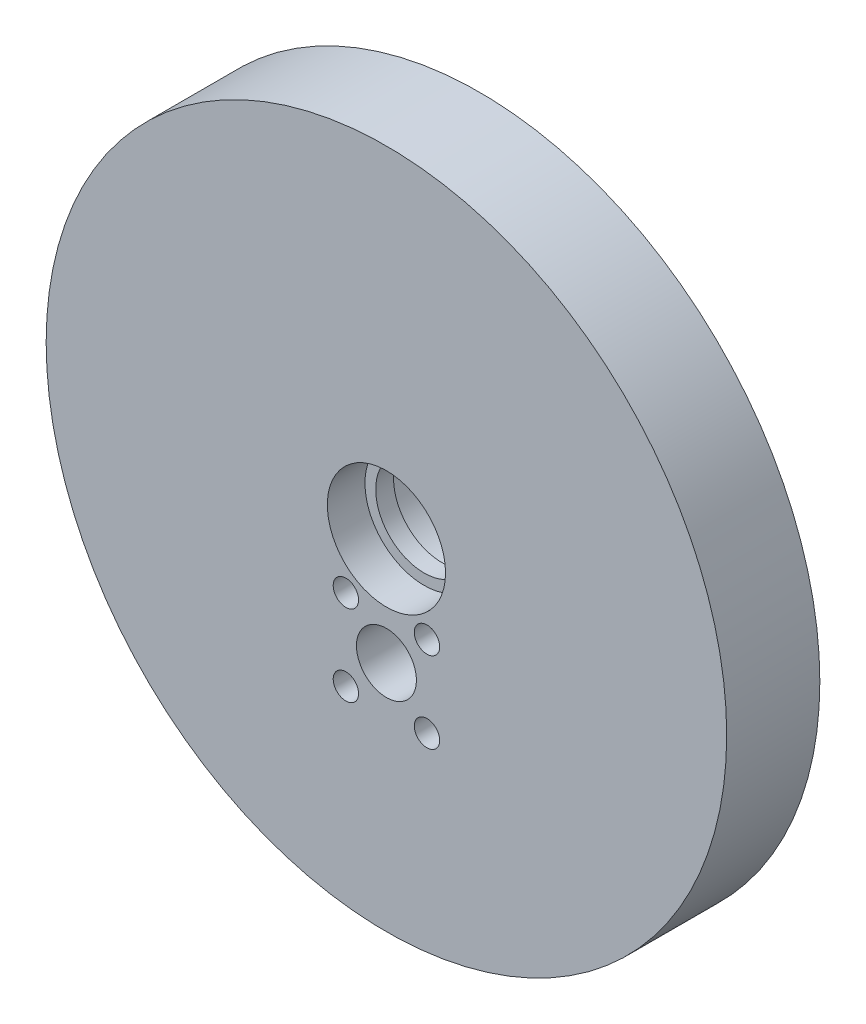
ISO-10303-21;
HEADER;
FILE_DESCRIPTION(('STEP AP214'),'2;1');
FILE_NAME('part.step','',(''),(''),'','','');
FILE_SCHEMA(('AUTOMOTIVE_DESIGN { 1 0 10303 214 1 1 1 1 }'));
ENDSEC;
DATA;
#1=APPLICATION_CONTEXT('core data for automotive mechanical design processes');
#2=APPLICATION_PROTOCOL_DEFINITION('international standard','automotive_design',2000,#1);
#3=PRODUCT_CONTEXT('',#1,'mechanical');
#4=PRODUCT('Part','Part','',(#3));
#5=PRODUCT_RELATED_PRODUCT_CATEGORY('part','',(#4));
#6=PRODUCT_DEFINITION_FORMATION('','',#4);
#7=PRODUCT_DEFINITION_CONTEXT('part definition',#1,'design');
#8=PRODUCT_DEFINITION('design','',#6,#7);
#9=PRODUCT_DEFINITION_SHAPE('','',#8);
#10=(LENGTH_UNIT() NAMED_UNIT(*) SI_UNIT(.MILLI.,.METRE.));
#11=(NAMED_UNIT(*) PLANE_ANGLE_UNIT() SI_UNIT($,.RADIAN.));
#12=(NAMED_UNIT(*) SI_UNIT($,.STERADIAN.) SOLID_ANGLE_UNIT());
#13=UNCERTAINTY_MEASURE_WITH_UNIT(LENGTH_MEASURE(1.E-05),#10,'distance_accuracy_value','');
#14=(GEOMETRIC_REPRESENTATION_CONTEXT(3) GLOBAL_UNCERTAINTY_ASSIGNED_CONTEXT((#13)) GLOBAL_UNIT_ASSIGNED_CONTEXT((#10,
#11,#12)) REPRESENTATION_CONTEXT('',''));
#15=CARTESIAN_POINT('',(0.,0.,0.));
#16=DIRECTION('',(0.,0.,1.));
#17=DIRECTION('',(1.,0.,0.));
#18=AXIS2_PLACEMENT_3D('',#15,#16,#17);
#19=CARTESIAN_POINT('',(0.,0.,13.208));
#20=DIRECTION('',(0.,0.,-1.));
#21=DIRECTION('',(-1.,0.,0.));
#22=AXIS2_PLACEMENT_3D('',#19,#20,#21);
#23=CYLINDRICAL_SURFACE('',#22,48.26);
#24=CARTESIAN_POINT('',(0.,0.,13.208));
#25=DIRECTION('',(0.,0.,1.));
#26=DIRECTION('',(1.,0.,0.));
#27=AXIS2_PLACEMENT_3D('',#24,#25,#26);
#28=CIRCLE('',#27,48.26);
#29=CARTESIAN_POINT('',(-48.26,0.,13.208));
#30=VERTEX_POINT('',#29);
#31=EDGE_CURVE('E10',#30,#30,#28,.T.);
#32=CARTESIAN_POINT('',(0.,0.,0.));
#33=DIRECTION('',(0.,0.,1.));
#34=DIRECTION('',(1.,0.,0.));
#35=AXIS2_PLACEMENT_3D('',#32,#33,#34);
#36=CIRCLE('',#35,48.26);
#37=CARTESIAN_POINT('',(-48.26,0.,0.));
#38=VERTEX_POINT('',#37);
#39=EDGE_CURVE('E49',#38,#38,#36,.T.);
#40=CARTESIAN_POINT('',(-48.26,0.,13.208));
#41=CARTESIAN_POINT('',(-48.26,0.,13.0704166666667));
#42=CARTESIAN_POINT('',(-48.26,0.,12.9328333333333));
#43=CARTESIAN_POINT('',(-48.26,0.,12.6576666666667));
#44=CARTESIAN_POINT('',(-48.26,0.,12.5200833333333));
#45=CARTESIAN_POINT('',(-48.26,0.,12.2449166666667));
#46=CARTESIAN_POINT('',(-48.26,0.,12.1073333333333));
#47=CARTESIAN_POINT('',(-48.26,0.,11.8321666666667));
#48=CARTESIAN_POINT('',(-48.26,0.,11.6945833333333));
#49=CARTESIAN_POINT('',(-48.26,0.,11.4194166666667));
#50=CARTESIAN_POINT('',(-48.26,0.,11.2818333333333));
#51=CARTESIAN_POINT('',(-48.26,0.,11.0066666666667));
#52=CARTESIAN_POINT('',(-48.26,0.,10.8690833333333));
#53=CARTESIAN_POINT('',(-48.26,0.,10.5939166666667));
#54=CARTESIAN_POINT('',(-48.26,0.,10.4563333333333));
#55=CARTESIAN_POINT('',(-48.26,0.,10.1811666666667));
#56=CARTESIAN_POINT('',(-48.26,0.,10.0435833333333));
#57=CARTESIAN_POINT('',(-48.26,0.,9.76841666666667));
#58=CARTESIAN_POINT('',(-48.26,0.,9.63083333333333));
#59=CARTESIAN_POINT('',(-48.26,0.,9.35566666666666));
#60=CARTESIAN_POINT('',(-48.26,0.,9.21808333333333));
#61=CARTESIAN_POINT('',(-48.26,0.,8.94291666666667));
#62=CARTESIAN_POINT('',(-48.26,0.,8.80533333333333));
#63=CARTESIAN_POINT('',(-48.26,0.,8.53016666666666));
#64=CARTESIAN_POINT('',(-48.26,0.,8.39258333333333));
#65=CARTESIAN_POINT('',(-48.26,0.,8.11741666666667));
#66=CARTESIAN_POINT('',(-48.26,0.,7.97983333333333));
#67=CARTESIAN_POINT('',(-48.26,0.,7.70466666666667));
#68=CARTESIAN_POINT('',(-48.26,0.,7.56708333333333));
#69=CARTESIAN_POINT('',(-48.26,0.,7.29191666666667));
#70=CARTESIAN_POINT('',(-48.26,0.,7.15433333333333));
#71=CARTESIAN_POINT('',(-48.26,0.,6.87916666666667));
#72=CARTESIAN_POINT('',(-48.26,0.,6.74158333333333));
#73=CARTESIAN_POINT('',(-48.26,0.,6.46641666666667));
#74=CARTESIAN_POINT('',(-48.26,0.,6.32883333333333));
#75=CARTESIAN_POINT('',(-48.26,0.,6.05366666666667));
#76=CARTESIAN_POINT('',(-48.26,0.,5.91608333333333));
#77=CARTESIAN_POINT('',(-48.26,0.,5.64091666666667));
#78=CARTESIAN_POINT('',(-48.26,0.,5.50333333333333));
#79=CARTESIAN_POINT('',(-48.26,0.,5.22816666666667));
#80=CARTESIAN_POINT('',(-48.26,0.,5.09058333333333));
#81=CARTESIAN_POINT('',(-48.26,0.,4.81541666666667));
#82=CARTESIAN_POINT('',(-48.26,0.,4.67783333333333));
#83=CARTESIAN_POINT('',(-48.26,0.,4.40266666666667));
#84=CARTESIAN_POINT('',(-48.26,0.,4.26508333333333));
#85=CARTESIAN_POINT('',(-48.26,0.,3.98991666666667));
#86=CARTESIAN_POINT('',(-48.26,0.,3.85233333333333));
#87=CARTESIAN_POINT('',(-48.26,0.,3.57716666666667));
#88=CARTESIAN_POINT('',(-48.26,0.,3.43958333333333));
#89=CARTESIAN_POINT('',(-48.26,0.,3.16441666666667));
#90=CARTESIAN_POINT('',(-48.26,0.,3.02683333333333));
#91=CARTESIAN_POINT('',(-48.26,0.,2.75166666666667));
#92=CARTESIAN_POINT('',(-48.26,0.,2.61408333333333));
#93=CARTESIAN_POINT('',(-48.26,0.,2.33891666666667));
#94=CARTESIAN_POINT('',(-48.26,0.,2.20133333333333));
#95=CARTESIAN_POINT('',(-48.26,0.,1.92616666666667));
#96=CARTESIAN_POINT('',(-48.26,0.,1.78858333333333));
#97=CARTESIAN_POINT('',(-48.26,0.,1.51341666666667));
#98=CARTESIAN_POINT('',(-48.26,0.,1.37583333333333));
#99=CARTESIAN_POINT('',(-48.26,0.,1.10066666666667));
#100=CARTESIAN_POINT('',(-48.26,0.,0.963083333333333));
#101=CARTESIAN_POINT('',(-48.26,0.,0.687916666666667));
#102=CARTESIAN_POINT('',(-48.26,0.,0.550333333333333));
#103=CARTESIAN_POINT('',(-48.26,0.,0.275166666666667));
#104=CARTESIAN_POINT('',(-48.26,0.,0.137583333333333));
#105=CARTESIAN_POINT('',(-48.26,0.,0.));
#106=B_SPLINE_CURVE_WITH_KNOTS('',3,(#40,#41,#42,#43,#44,#45,#46,#47,#48,#49,#50,#51,#52,#53,
#54,#55,#56,#57,#58,#59,#60,#61,#62,#63,#64,#65,#66,#67,#68,#69,#70,#71,#72,#73,#74,#75,#76,#77,
#78,#79,#80,#81,#82,#83,#84,#85,#86,#87,#88,#89,#90,#91,#92,#93,#94,#95,#96,#97,#98,#99,#100,
#101,#102,#103,#104,#105),.UNSPECIFIED.,.F.,.F.,(4,2,2,2,2,2,2,2,2,2,2,2,2,2,2,2,2,2,2,2,2,2,2,
2,2,2,2,2,2,2,2,2,4),(0.,0.412750000000002,0.825500000000002,1.23825,1.651,2.06375,2.4765,
2.88925,3.302,3.71475,4.1275,4.54025,4.953,5.36575,5.7785,6.19125,6.604,7.01675,7.4295,7.84225,
8.255,8.66775,9.0805,9.49325,9.906,10.31875,10.7315,11.14425,11.557,11.96975,12.3825,12.79525,
13.208),.UNSPECIFIED.);
#107=EDGE_CURVE('BSEAM41',#30,#38,#106,.T.);
#108=ORIENTED_EDGE('',*,*,#31,.F.);
#109=ORIENTED_EDGE('',*,*,#39,.T.);
#110=ORIENTED_EDGE('',*,*,#107,.T.);
#111=ORIENTED_EDGE('',*,*,#107,.F.);
#112=EDGE_LOOP('',(#108,#110,#109,#111));
#113=FACE_BOUND('',#112,.T.);
#114=ADVANCED_FACE('F41',(#113),#23,.T.);
#115=CARTESIAN_POINT('',(0.,0.,13.208));
#116=DIRECTION('',(0.,0.,1.));
#117=DIRECTION('',(1.,0.,0.));
#118=AXIS2_PLACEMENT_3D('',#115,#116,#117);
#119=PLANE('',#118);
#120=CARTESIAN_POINT('',(5.75,-9.49,13.208));
#121=DIRECTION('',(0.,0.,-1.));
#122=DIRECTION('',(-1.,0.,0.));
#123=AXIS2_PLACEMENT_3D('',#120,#121,#122);
#124=CIRCLE('',#123,1.8);
#125=CARTESIAN_POINT('',(3.95,-9.49,13.208));
#126=VERTEX_POINT('',#125);
#127=EDGE_CURVE('E81',#126,#126,#124,.T.);
#128=ORIENTED_EDGE('',*,*,#127,.T.);
#129=EDGE_LOOP('',(#128));
#130=FACE_BOUND('',#129,.T.);
#131=CARTESIAN_POINT('',(5.75,-20.99,13.208));
#132=DIRECTION('',(0.,0.,-1.));
#133=DIRECTION('',(-1.,0.,0.));
#134=AXIS2_PLACEMENT_3D('',#131,#132,#133);
#135=CIRCLE('',#134,1.8);
#136=CARTESIAN_POINT('',(3.95,-20.99,13.208));
#137=VERTEX_POINT('',#136);
#138=EDGE_CURVE('E90',#137,#137,#135,.T.);
#139=ORIENTED_EDGE('',*,*,#138,.T.);
#140=EDGE_LOOP('',(#139));
#141=FACE_BOUND('',#140,.T.);
#142=CARTESIAN_POINT('',(-5.75,-20.99,13.208));
#143=DIRECTION('',(0.,0.,-1.));
#144=DIRECTION('',(-1.,0.,0.));
#145=AXIS2_PLACEMENT_3D('',#142,#143,#144);
#146=CIRCLE('',#145,1.8);
#147=CARTESIAN_POINT('',(-7.55,-20.99,13.208));
#148=VERTEX_POINT('',#147);
#149=EDGE_CURVE('E98',#148,#148,#146,.T.);
#150=ORIENTED_EDGE('',*,*,#149,.T.);
#151=EDGE_LOOP('',(#150));
#152=FACE_BOUND('',#151,.T.);
#153=CARTESIAN_POINT('',(-5.75,-9.49,13.208));
#154=DIRECTION('',(0.,0.,-1.));
#155=DIRECTION('',(-1.,0.,0.));
#156=AXIS2_PLACEMENT_3D('',#153,#154,#155);
#157=CIRCLE('',#156,1.8);
#158=CARTESIAN_POINT('',(-7.55,-9.49,13.208));
#159=VERTEX_POINT('',#158);
#160=EDGE_CURVE('E69',#159,#159,#157,.T.);
#161=ORIENTED_EDGE('',*,*,#160,.T.);
#162=EDGE_LOOP('',(#161));
#163=FACE_BOUND('',#162,.T.);
#164=CARTESIAN_POINT('',(0.,-15.24,13.208));
#165=DIRECTION('',(0.,0.,-1.));
#166=DIRECTION('',(-1.,0.,0.));
#167=AXIS2_PLACEMENT_3D('',#164,#165,#166);
#168=CIRCLE('',#167,4.25);
#169=CARTESIAN_POINT('',(-4.25,-15.24,13.208));
#170=VERTEX_POINT('',#169);
#171=EDGE_CURVE('E61',#170,#170,#168,.T.);
#172=ORIENTED_EDGE('',*,*,#171,.T.);
#173=EDGE_LOOP('',(#172));
#174=FACE_BOUND('',#173,.T.);
#175=CARTESIAN_POINT('',(0.,0.,13.208));
#176=DIRECTION('',(0.,0.,1.));
#177=DIRECTION('',(1.,0.,0.));
#178=AXIS2_PLACEMENT_3D('',#175,#176,#177);
#179=CIRCLE('',#178,8.382);
#180=CARTESIAN_POINT('',(8.382,0.,13.208));
#181=VERTEX_POINT('',#180);
#182=EDGE_CURVE('E57',#181,#181,#179,.T.);
#183=ORIENTED_EDGE('',*,*,#182,.F.);
#184=EDGE_LOOP('',(#183));
#185=FACE_BOUND('',#184,.T.);
#186=ORIENTED_EDGE('',*,*,#31,.T.);
#187=EDGE_LOOP('',(#186));
#188=FACE_BOUND('',#187,.T.);
#189=ADVANCED_FACE('F140',(#130,#141,#152,#163,#174,#185,#188),#119,.T.);
#190=CARTESIAN_POINT('',(0.,0.,0.));
#191=DIRECTION('',(0.,0.,1.));
#192=DIRECTION('',(1.,0.,0.));
#193=AXIS2_PLACEMENT_3D('',#190,#191,#192);
#194=PLANE('',#193);
#195=CARTESIAN_POINT('',(0.,0.,0.));
#196=DIRECTION('',(0.,0.,1.));
#197=DIRECTION('',(1.,0.,0.));
#198=AXIS2_PLACEMENT_3D('',#195,#196,#197);
#199=CIRCLE('',#198,8.382);
#200=CARTESIAN_POINT('',(8.382,0.,0.));
#201=VERTEX_POINT('',#200);
#202=EDGE_CURVE('E105',#201,#201,#199,.T.);
#203=ORIENTED_EDGE('',*,*,#202,.T.);
#204=EDGE_LOOP('',(#203));
#205=FACE_BOUND('',#204,.T.);
#206=CARTESIAN_POINT('',(5.75,-9.49,0.));
#207=DIRECTION('',(0.,0.,-1.));
#208=DIRECTION('',(-1.,0.,0.));
#209=AXIS2_PLACEMENT_3D('',#206,#207,#208);
#210=CIRCLE('',#209,1.8);
#211=CARTESIAN_POINT('',(3.95,-9.49,0.));
#212=VERTEX_POINT('',#211);
#213=EDGE_CURVE('E85',#212,#212,#210,.T.);
#214=ORIENTED_EDGE('',*,*,#213,.F.);
#215=EDGE_LOOP('',(#214));
#216=FACE_BOUND('',#215,.T.);
#217=CARTESIAN_POINT('',(5.75,-20.99,0.));
#218=DIRECTION('',(0.,0.,-1.));
#219=DIRECTION('',(-1.,0.,0.));
#220=AXIS2_PLACEMENT_3D('',#217,#218,#219);
#221=CIRCLE('',#220,1.8);
#222=CARTESIAN_POINT('',(3.95,-20.99,0.));
#223=VERTEX_POINT('',#222);
#224=EDGE_CURVE('E94',#223,#223,#221,.T.);
#225=ORIENTED_EDGE('',*,*,#224,.F.);
#226=EDGE_LOOP('',(#225));
#227=FACE_BOUND('',#226,.T.);
#228=CARTESIAN_POINT('',(-5.75,-20.99,0.));
#229=DIRECTION('',(0.,0.,-1.));
#230=DIRECTION('',(-1.,0.,0.));
#231=AXIS2_PLACEMENT_3D('',#228,#229,#230);
#232=CIRCLE('',#231,1.8);
#233=CARTESIAN_POINT('',(-7.55,-20.99,0.));
#234=VERTEX_POINT('',#233);
#235=EDGE_CURVE('E77',#234,#234,#232,.T.);
#236=ORIENTED_EDGE('',*,*,#235,.F.);
#237=EDGE_LOOP('',(#236));
#238=FACE_BOUND('',#237,.T.);
#239=CARTESIAN_POINT('',(-5.75,-9.49,0.));
#240=DIRECTION('',(0.,0.,-1.));
#241=DIRECTION('',(-1.,0.,0.));
#242=AXIS2_PLACEMENT_3D('',#239,#240,#241);
#243=CIRCLE('',#242,1.8);
#244=CARTESIAN_POINT('',(-7.55,-9.49,0.));
#245=VERTEX_POINT('',#244);
#246=EDGE_CURVE('E73',#245,#245,#243,.T.);
#247=ORIENTED_EDGE('',*,*,#246,.F.);
#248=EDGE_LOOP('',(#247));
#249=FACE_BOUND('',#248,.T.);
#250=CARTESIAN_POINT('',(0.,-15.24,0.));
#251=DIRECTION('',(0.,0.,-1.));
#252=DIRECTION('',(-1.,0.,0.));
#253=AXIS2_PLACEMENT_3D('',#250,#251,#252);
#254=CIRCLE('',#253,4.25);
#255=CARTESIAN_POINT('',(-4.25,-15.24,0.));
#256=VERTEX_POINT('',#255);
#257=EDGE_CURVE('E65',#256,#256,#254,.T.);
#258=ORIENTED_EDGE('',*,*,#257,.F.);
#259=EDGE_LOOP('',(#258));
#260=FACE_BOUND('',#259,.T.);
#261=ORIENTED_EDGE('',*,*,#39,.F.);
#262=EDGE_LOOP('',(#261));
#263=FACE_BOUND('',#262,.T.);
#264=ADVANCED_FACE('F136',(#205,#216,#227,#238,#249,#260,#263),#194,.F.);
#265=CARTESIAN_POINT('',(0.,0.,7.874));
#266=DIRECTION('',(0.,0.,1.));
#267=DIRECTION('',(1.,0.,0.));
#268=AXIS2_PLACEMENT_3D('',#265,#266,#267);
#269=CYLINDRICAL_SURFACE('',#268,8.382);
#270=CARTESIAN_POINT('',(0.,0.,7.874));
#271=DIRECTION('',(0.,0.,1.));
#272=DIRECTION('',(1.,0.,0.));
#273=AXIS2_PLACEMENT_3D('',#270,#271,#272);
#274=CIRCLE('',#273,8.382);
#275=CARTESIAN_POINT('',(8.382,0.,7.874));
#276=VERTEX_POINT('',#275);
#277=EDGE_CURVE('E55',#276,#276,#274,.T.);
#278=ORIENTED_EDGE('',*,*,#277,.F.);
#279=EDGE_LOOP('',(#278));
#280=FACE_BOUND('',#279,.T.);
#281=ORIENTED_EDGE('',*,*,#182,.T.);
#282=EDGE_LOOP('',(#281));
#283=FACE_BOUND('',#282,.T.);
#284=ADVANCED_FACE('F139',(#280,#283),#269,.F.);
#285=CARTESIAN_POINT('',(0.,0.,7.874));
#286=DIRECTION('',(0.,0.,1.));
#287=DIRECTION('',(1.,0.,0.));
#288=AXIS2_PLACEMENT_3D('',#285,#286,#287);
#289=PLANE('',#288);
#290=CARTESIAN_POINT('',(0.,0.,7.874));
#291=DIRECTION('',(0.,0.,1.));
#292=DIRECTION('',(1.,0.,0.));
#293=AXIS2_PLACEMENT_3D('',#290,#291,#292);
#294=CIRCLE('',#293,6.858);
#295=CARTESIAN_POINT('',(6.858,0.,7.874));
#296=VERTEX_POINT('',#295);
#297=EDGE_CURVE('E109',#296,#296,#294,.T.);
#298=ORIENTED_EDGE('',*,*,#297,.F.);
#299=EDGE_LOOP('',(#298));
#300=FACE_BOUND('',#299,.T.);
#301=ORIENTED_EDGE('',*,*,#277,.T.);
#302=EDGE_LOOP('',(#301));
#303=FACE_BOUND('',#302,.T.);
#304=ADVANCED_FACE('F166',(#300,#303),#289,.T.);
#305=CARTESIAN_POINT('',(0.,-15.24,13.208));
#306=DIRECTION('',(0.,0.,-1.));
#307=DIRECTION('',(-1.,0.,0.));
#308=AXIS2_PLACEMENT_3D('',#305,#306,#307);
#309=CYLINDRICAL_SURFACE('',#308,4.25);
#310=CARTESIAN_POINT('',(-4.25,-15.24,13.208));
#311=CARTESIAN_POINT('',(-4.25,-15.24,13.0704166666667));
#312=CARTESIAN_POINT('',(-4.25,-15.24,12.9328333333333));
#313=CARTESIAN_POINT('',(-4.25,-15.24,12.6576666666667));
#314=CARTESIAN_POINT('',(-4.25,-15.24,12.5200833333333));
#315=CARTESIAN_POINT('',(-4.25,-15.24,12.2449166666667));
#316=CARTESIAN_POINT('',(-4.25,-15.24,12.1073333333333));
#317=CARTESIAN_POINT('',(-4.25,-15.24,11.8321666666667));
#318=CARTESIAN_POINT('',(-4.25,-15.24,11.6945833333333));
#319=CARTESIAN_POINT('',(-4.25,-15.24,11.4194166666667));
#320=CARTESIAN_POINT('',(-4.25,-15.24,11.2818333333333));
#321=CARTESIAN_POINT('',(-4.25,-15.24,11.0066666666667));
#322=CARTESIAN_POINT('',(-4.25,-15.24,10.8690833333333));
#323=CARTESIAN_POINT('',(-4.25,-15.24,10.5939166666667));
#324=CARTESIAN_POINT('',(-4.25,-15.24,10.4563333333333));
#325=CARTESIAN_POINT('',(-4.25,-15.24,10.1811666666667));
#326=CARTESIAN_POINT('',(-4.25,-15.24,10.0435833333333));
#327=CARTESIAN_POINT('',(-4.25,-15.24,9.76841666666667));
#328=CARTESIAN_POINT('',(-4.25,-15.24,9.63083333333333));
#329=CARTESIAN_POINT('',(-4.25,-15.24,9.35566666666667));
#330=CARTESIAN_POINT('',(-4.25,-15.24,9.21808333333333));
#331=CARTESIAN_POINT('',(-4.25,-15.24,8.94291666666667));
#332=CARTESIAN_POINT('',(-4.25,-15.24,8.80533333333334));
#333=CARTESIAN_POINT('',(-4.25,-15.24,8.53016666666667));
#334=CARTESIAN_POINT('',(-4.25,-15.24,8.39258333333333));
#335=CARTESIAN_POINT('',(-4.25,-15.24,8.11741666666667));
#336=CARTESIAN_POINT('',(-4.25,-15.24,7.97983333333333));
#337=CARTESIAN_POINT('',(-4.25,-15.24,7.70466666666667));
#338=CARTESIAN_POINT('',(-4.25,-15.24,7.56708333333333));
#339=CARTESIAN_POINT('',(-4.25,-15.24,7.29191666666667));
#340=CARTESIAN_POINT('',(-4.25,-15.24,7.15433333333333));
#341=CARTESIAN_POINT('',(-4.25,-15.24,6.87916666666667));
#342=CARTESIAN_POINT('',(-4.25,-15.24,6.74158333333333));
#343=CARTESIAN_POINT('',(-4.25,-15.24,6.46641666666667));
#344=CARTESIAN_POINT('',(-4.25,-15.24,6.32883333333333));
#345=CARTESIAN_POINT('',(-4.25,-15.24,6.05366666666667));
#346=CARTESIAN_POINT('',(-4.25,-15.24,5.91608333333333));
#347=CARTESIAN_POINT('',(-4.25,-15.24,5.64091666666667));
#348=CARTESIAN_POINT('',(-4.25,-15.24,5.50333333333333));
#349=CARTESIAN_POINT('',(-4.25,-15.24,5.22816666666667));
#350=CARTESIAN_POINT('',(-4.25,-15.24,5.09058333333333));
#351=CARTESIAN_POINT('',(-4.25,-15.24,4.81541666666667));
#352=CARTESIAN_POINT('',(-4.25,-15.24,4.67783333333333));
#353=CARTESIAN_POINT('',(-4.25,-15.24,4.40266666666667));
#354=CARTESIAN_POINT('',(-4.25,-15.24,4.26508333333333));
#355=CARTESIAN_POINT('',(-4.25,-15.24,3.98991666666667));
#356=CARTESIAN_POINT('',(-4.25,-15.24,3.85233333333333));
#357=CARTESIAN_POINT('',(-4.25,-15.24,3.57716666666667));
#358=CARTESIAN_POINT('',(-4.25,-15.24,3.43958333333333));
#359=CARTESIAN_POINT('',(-4.25,-15.24,3.16441666666667));
#360=CARTESIAN_POINT('',(-4.25,-15.24,3.02683333333333));
#361=CARTESIAN_POINT('',(-4.25,-15.24,2.75166666666667));
#362=CARTESIAN_POINT('',(-4.25,-15.24,2.61408333333333));
#363=CARTESIAN_POINT('',(-4.25,-15.24,2.33891666666667));
#364=CARTESIAN_POINT('',(-4.25,-15.24,2.20133333333333));
#365=CARTESIAN_POINT('',(-4.25,-15.24,1.92616666666667));
#366=CARTESIAN_POINT('',(-4.25,-15.24,1.78858333333333));
#367=CARTESIAN_POINT('',(-4.25,-15.24,1.51341666666667));
#368=CARTESIAN_POINT('',(-4.25,-15.24,1.37583333333333));
#369=CARTESIAN_POINT('',(-4.25,-15.24,1.10066666666667));
#370=CARTESIAN_POINT('',(-4.25,-15.24,0.963083333333333));
#371=CARTESIAN_POINT('',(-4.25,-15.24,0.687916666666667));
#372=CARTESIAN_POINT('',(-4.25,-15.24,0.550333333333333));
#373=CARTESIAN_POINT('',(-4.25,-15.24,0.275166666666667));
#374=CARTESIAN_POINT('',(-4.25,-15.24,0.137583333333333));
#375=CARTESIAN_POINT('',(-4.25,-15.24,0.));
#376=B_SPLINE_CURVE_WITH_KNOTS('',3,(#310,#311,#312,#313,#314,#315,#316,#317,#318,#319,#320,
#321,#322,#323,#324,#325,#326,#327,#328,#329,#330,#331,#332,#333,#334,#335,#336,#337,#338,#339,
#340,#341,#342,#343,#344,#345,#346,#347,#348,#349,#350,#351,#352,#353,#354,#355,#356,#357,#358,
#359,#360,#361,#362,#363,#364,#365,#366,#367,#368,#369,#370,#371,#372,#373,#374,#375),
.UNSPECIFIED.,.F.,.F.,(4,2,2,2,2,2,2,2,2,2,2,2,2,2,2,2,2,2,2,2,2,2,2,2,2,2,2,2,2,2,2,2,4),(0.,
0.41275,0.8255,1.23825,1.651,2.06375,2.4765,2.88925,3.302,3.71475,4.1275,4.54025,4.953,5.36575,
5.7785,6.19125,6.604,7.01675,7.4295,7.84225,8.255,8.66775,9.0805,9.49325,9.906,10.31875,10.7315,
11.14425,11.557,11.96975,12.3825,12.79525,13.208),.UNSPECIFIED.);
#377=EDGE_CURVE('BSEAM170',#170,#256,#376,.T.);
#378=ORIENTED_EDGE('',*,*,#171,.F.);
#379=ORIENTED_EDGE('',*,*,#257,.T.);
#380=ORIENTED_EDGE('',*,*,#377,.T.);
#381=ORIENTED_EDGE('',*,*,#377,.F.);
#382=EDGE_LOOP('',(#378,#380,#379,#381));
#383=FACE_BOUND('',#382,.T.);
#384=ADVANCED_FACE('F170',(#383),#309,.F.);
#385=CARTESIAN_POINT('',(-5.75,-9.49,13.208));
#386=DIRECTION('',(0.,0.,-1.));
#387=DIRECTION('',(-1.,0.,0.));
#388=AXIS2_PLACEMENT_3D('',#385,#386,#387);
#389=CYLINDRICAL_SURFACE('',#388,1.8);
#390=CARTESIAN_POINT('',(-7.55,-9.49,13.208));
#391=CARTESIAN_POINT('',(-7.55,-9.49,13.0704166666667));
#392=CARTESIAN_POINT('',(-7.55,-9.49,12.9328333333333));
#393=CARTESIAN_POINT('',(-7.55,-9.49,12.6576666666667));
#394=CARTESIAN_POINT('',(-7.55,-9.49,12.5200833333333));
#395=CARTESIAN_POINT('',(-7.55,-9.49,12.2449166666667));
#396=CARTESIAN_POINT('',(-7.55,-9.49,12.1073333333333));
#397=CARTESIAN_POINT('',(-7.55,-9.49,11.8321666666667));
#398=CARTESIAN_POINT('',(-7.55,-9.49,11.6945833333333));
#399=CARTESIAN_POINT('',(-7.55,-9.49,11.4194166666667));
#400=CARTESIAN_POINT('',(-7.55,-9.49,11.2818333333333));
#401=CARTESIAN_POINT('',(-7.55,-9.49,11.0066666666667));
#402=CARTESIAN_POINT('',(-7.55,-9.49,10.8690833333333));
#403=CARTESIAN_POINT('',(-7.55,-9.49,10.5939166666667));
#404=CARTESIAN_POINT('',(-7.55,-9.49,10.4563333333333));
#405=CARTESIAN_POINT('',(-7.55,-9.49,10.1811666666667));
#406=CARTESIAN_POINT('',(-7.55,-9.49,10.0435833333333));
#407=CARTESIAN_POINT('',(-7.55,-9.49,9.76841666666667));
#408=CARTESIAN_POINT('',(-7.55,-9.49,9.63083333333333));
#409=CARTESIAN_POINT('',(-7.55,-9.49,9.35566666666667));
#410=CARTESIAN_POINT('',(-7.55,-9.49,9.21808333333333));
#411=CARTESIAN_POINT('',(-7.55,-9.49,8.94291666666667));
#412=CARTESIAN_POINT('',(-7.55,-9.49,8.80533333333334));
#413=CARTESIAN_POINT('',(-7.55,-9.49,8.53016666666667));
#414=CARTESIAN_POINT('',(-7.55,-9.49,8.39258333333333));
#415=CARTESIAN_POINT('',(-7.55,-9.49,8.11741666666667));
#416=CARTESIAN_POINT('',(-7.55,-9.49,7.97983333333333));
#417=CARTESIAN_POINT('',(-7.55,-9.49,7.70466666666667));
#418=CARTESIAN_POINT('',(-7.55,-9.49,7.56708333333333));
#419=CARTESIAN_POINT('',(-7.55,-9.49,7.29191666666667));
#420=CARTESIAN_POINT('',(-7.55,-9.49,7.15433333333333));
#421=CARTESIAN_POINT('',(-7.55,-9.49,6.87916666666667));
#422=CARTESIAN_POINT('',(-7.55,-9.49,6.74158333333333));
#423=CARTESIAN_POINT('',(-7.55,-9.49,6.46641666666667));
#424=CARTESIAN_POINT('',(-7.55,-9.49,6.32883333333333));
#425=CARTESIAN_POINT('',(-7.55,-9.49,6.05366666666667));
#426=CARTESIAN_POINT('',(-7.55,-9.49,5.91608333333333));
#427=CARTESIAN_POINT('',(-7.55,-9.49,5.64091666666667));
#428=CARTESIAN_POINT('',(-7.55,-9.49,5.50333333333333));
#429=CARTESIAN_POINT('',(-7.55,-9.49,5.22816666666667));
#430=CARTESIAN_POINT('',(-7.55,-9.49,5.09058333333333));
#431=CARTESIAN_POINT('',(-7.55,-9.49,4.81541666666667));
#432=CARTESIAN_POINT('',(-7.55,-9.49,4.67783333333333));
#433=CARTESIAN_POINT('',(-7.55,-9.49,4.40266666666667));
#434=CARTESIAN_POINT('',(-7.55,-9.49,4.26508333333333));
#435=CARTESIAN_POINT('',(-7.55,-9.49,3.98991666666667));
#436=CARTESIAN_POINT('',(-7.55,-9.49,3.85233333333333));
#437=CARTESIAN_POINT('',(-7.55,-9.49,3.57716666666667));
#438=CARTESIAN_POINT('',(-7.55,-9.49,3.43958333333333));
#439=CARTESIAN_POINT('',(-7.55,-9.49,3.16441666666667));
#440=CARTESIAN_POINT('',(-7.55,-9.49,3.02683333333333));
#441=CARTESIAN_POINT('',(-7.55,-9.49,2.75166666666667));
#442=CARTESIAN_POINT('',(-7.55,-9.49,2.61408333333333));
#443=CARTESIAN_POINT('',(-7.55,-9.49,2.33891666666667));
#444=CARTESIAN_POINT('',(-7.55,-9.49,2.20133333333333));
#445=CARTESIAN_POINT('',(-7.55,-9.49,1.92616666666667));
#446=CARTESIAN_POINT('',(-7.55,-9.49,1.78858333333333));
#447=CARTESIAN_POINT('',(-7.55,-9.49,1.51341666666667));
#448=CARTESIAN_POINT('',(-7.55,-9.49,1.37583333333333));
#449=CARTESIAN_POINT('',(-7.55,-9.49,1.10066666666667));
#450=CARTESIAN_POINT('',(-7.55,-9.49,0.963083333333333));
#451=CARTESIAN_POINT('',(-7.55,-9.49,0.687916666666667));
#452=CARTESIAN_POINT('',(-7.55,-9.49,0.550333333333333));
#453=CARTESIAN_POINT('',(-7.55,-9.49,0.275166666666667));
#454=CARTESIAN_POINT('',(-7.55,-9.49,0.137583333333333));
#455=CARTESIAN_POINT('',(-7.55,-9.49,0.));
#456=B_SPLINE_CURVE_WITH_KNOTS('',3,(#390,#391,#392,#393,#394,#395,#396,#397,#398,#399,#400,
#401,#402,#403,#404,#405,#406,#407,#408,#409,#410,#411,#412,#413,#414,#415,#416,#417,#418,#419,
#420,#421,#422,#423,#424,#425,#426,#427,#428,#429,#430,#431,#432,#433,#434,#435,#436,#437,#438,
#439,#440,#441,#442,#443,#444,#445,#446,#447,#448,#449,#450,#451,#452,#453,#454,#455),
.UNSPECIFIED.,.F.,.F.,(4,2,2,2,2,2,2,2,2,2,2,2,2,2,2,2,2,2,2,2,2,2,2,2,2,2,2,2,2,2,2,2,4),(0.,
0.41275,0.8255,1.23825,1.651,2.06375,2.4765,2.88925,3.302,3.71475,4.1275,4.54025,4.953,5.36575,
5.7785,6.19125,6.604,7.01675,7.4295,7.84225,8.255,8.66775,9.0805,9.49325,9.906,10.31875,10.7315,
11.14425,11.557,11.96975,12.3825,12.79525,13.208),.UNSPECIFIED.);
#457=EDGE_CURVE('BSEAM174',#159,#245,#456,.T.);
#458=ORIENTED_EDGE('',*,*,#160,.F.);
#459=ORIENTED_EDGE('',*,*,#246,.T.);
#460=ORIENTED_EDGE('',*,*,#457,.T.);
#461=ORIENTED_EDGE('',*,*,#457,.F.);
#462=EDGE_LOOP('',(#458,#460,#459,#461));
#463=FACE_BOUND('',#462,.T.);
#464=ADVANCED_FACE('F174',(#463),#389,.F.);
#465=CARTESIAN_POINT('',(-5.75,-20.99,13.208));
#466=DIRECTION('',(0.,0.,-1.));
#467=DIRECTION('',(-1.,0.,0.));
#468=AXIS2_PLACEMENT_3D('',#465,#466,#467);
#469=CYLINDRICAL_SURFACE('',#468,1.8);
#470=CARTESIAN_POINT('',(-7.55,-20.99,13.208));
#471=CARTESIAN_POINT('',(-7.55,-20.99,13.0704166666667));
#472=CARTESIAN_POINT('',(-7.55,-20.99,12.9328333333333));
#473=CARTESIAN_POINT('',(-7.55,-20.99,12.6576666666667));
#474=CARTESIAN_POINT('',(-7.55,-20.99,12.5200833333333));
#475=CARTESIAN_POINT('',(-7.55,-20.99,12.2449166666667));
#476=CARTESIAN_POINT('',(-7.55,-20.99,12.1073333333333));
#477=CARTESIAN_POINT('',(-7.55,-20.99,11.8321666666667));
#478=CARTESIAN_POINT('',(-7.55,-20.99,11.6945833333333));
#479=CARTESIAN_POINT('',(-7.55,-20.99,11.4194166666667));
#480=CARTESIAN_POINT('',(-7.55,-20.99,11.2818333333333));
#481=CARTESIAN_POINT('',(-7.55,-20.99,11.0066666666667));
#482=CARTESIAN_POINT('',(-7.55,-20.99,10.8690833333333));
#483=CARTESIAN_POINT('',(-7.55,-20.99,10.5939166666667));
#484=CARTESIAN_POINT('',(-7.55,-20.99,10.4563333333333));
#485=CARTESIAN_POINT('',(-7.55,-20.99,10.1811666666667));
#486=CARTESIAN_POINT('',(-7.55,-20.99,10.0435833333333));
#487=CARTESIAN_POINT('',(-7.55,-20.99,9.76841666666667));
#488=CARTESIAN_POINT('',(-7.55,-20.99,9.63083333333333));
#489=CARTESIAN_POINT('',(-7.55,-20.99,9.35566666666667));
#490=CARTESIAN_POINT('',(-7.55,-20.99,9.21808333333333));
#491=CARTESIAN_POINT('',(-7.55,-20.99,8.94291666666667));
#492=CARTESIAN_POINT('',(-7.55,-20.99,8.80533333333334));
#493=CARTESIAN_POINT('',(-7.55,-20.99,8.53016666666667));
#494=CARTESIAN_POINT('',(-7.55,-20.99,8.39258333333333));
#495=CARTESIAN_POINT('',(-7.55,-20.99,8.11741666666667));
#496=CARTESIAN_POINT('',(-7.55,-20.99,7.97983333333333));
#497=CARTESIAN_POINT('',(-7.55,-20.99,7.70466666666667));
#498=CARTESIAN_POINT('',(-7.55,-20.99,7.56708333333333));
#499=CARTESIAN_POINT('',(-7.55,-20.99,7.29191666666667));
#500=CARTESIAN_POINT('',(-7.55,-20.99,7.15433333333333));
#501=CARTESIAN_POINT('',(-7.55,-20.99,6.87916666666667));
#502=CARTESIAN_POINT('',(-7.55,-20.99,6.74158333333333));
#503=CARTESIAN_POINT('',(-7.55,-20.99,6.46641666666667));
#504=CARTESIAN_POINT('',(-7.55,-20.99,6.32883333333333));
#505=CARTESIAN_POINT('',(-7.55,-20.99,6.05366666666667));
#506=CARTESIAN_POINT('',(-7.55,-20.99,5.91608333333333));
#507=CARTESIAN_POINT('',(-7.55,-20.99,5.64091666666667));
#508=CARTESIAN_POINT('',(-7.55,-20.99,5.50333333333333));
#509=CARTESIAN_POINT('',(-7.55,-20.99,5.22816666666667));
#510=CARTESIAN_POINT('',(-7.55,-20.99,5.09058333333333));
#511=CARTESIAN_POINT('',(-7.55,-20.99,4.81541666666667));
#512=CARTESIAN_POINT('',(-7.55,-20.99,4.67783333333333));
#513=CARTESIAN_POINT('',(-7.55,-20.99,4.40266666666667));
#514=CARTESIAN_POINT('',(-7.55,-20.99,4.26508333333333));
#515=CARTESIAN_POINT('',(-7.55,-20.99,3.98991666666667));
#516=CARTESIAN_POINT('',(-7.55,-20.99,3.85233333333333));
#517=CARTESIAN_POINT('',(-7.55,-20.99,3.57716666666667));
#518=CARTESIAN_POINT('',(-7.55,-20.99,3.43958333333333));
#519=CARTESIAN_POINT('',(-7.55,-20.99,3.16441666666667));
#520=CARTESIAN_POINT('',(-7.55,-20.99,3.02683333333333));
#521=CARTESIAN_POINT('',(-7.55,-20.99,2.75166666666667));
#522=CARTESIAN_POINT('',(-7.55,-20.99,2.61408333333333));
#523=CARTESIAN_POINT('',(-7.55,-20.99,2.33891666666667));
#524=CARTESIAN_POINT('',(-7.55,-20.99,2.20133333333333));
#525=CARTESIAN_POINT('',(-7.55,-20.99,1.92616666666667));
#526=CARTESIAN_POINT('',(-7.55,-20.99,1.78858333333333));
#527=CARTESIAN_POINT('',(-7.55,-20.99,1.51341666666667));
#528=CARTESIAN_POINT('',(-7.55,-20.99,1.37583333333333));
#529=CARTESIAN_POINT('',(-7.55,-20.99,1.10066666666667));
#530=CARTESIAN_POINT('',(-7.55,-20.99,0.963083333333333));
#531=CARTESIAN_POINT('',(-7.55,-20.99,0.687916666666667));
#532=CARTESIAN_POINT('',(-7.55,-20.99,0.550333333333333));
#533=CARTESIAN_POINT('',(-7.55,-20.99,0.275166666666667));
#534=CARTESIAN_POINT('',(-7.55,-20.99,0.137583333333333));
#535=CARTESIAN_POINT('',(-7.55,-20.99,0.));
#536=B_SPLINE_CURVE_WITH_KNOTS('',3,(#470,#471,#472,#473,#474,#475,#476,#477,#478,#479,#480,
#481,#482,#483,#484,#485,#486,#487,#488,#489,#490,#491,#492,#493,#494,#495,#496,#497,#498,#499,
#500,#501,#502,#503,#504,#505,#506,#507,#508,#509,#510,#511,#512,#513,#514,#515,#516,#517,#518,
#519,#520,#521,#522,#523,#524,#525,#526,#527,#528,#529,#530,#531,#532,#533,#534,#535),
.UNSPECIFIED.,.F.,.F.,(4,2,2,2,2,2,2,2,2,2,2,2,2,2,2,2,2,2,2,2,2,2,2,2,2,2,2,2,2,2,2,2,4),(0.,
0.41275,0.8255,1.23825,1.651,2.06375,2.4765,2.88925,3.302,3.71475,4.1275,4.54025,4.953,5.36575,
5.7785,6.19125,6.604,7.01675,7.4295,7.84225,8.255,8.66775,9.0805,9.49325,9.906,10.31875,10.7315,
11.14425,11.557,11.96975,12.3825,12.79525,13.208),.UNSPECIFIED.);
#537=EDGE_CURVE('BSEAM178',#148,#234,#536,.T.);
#538=ORIENTED_EDGE('',*,*,#149,.F.);
#539=ORIENTED_EDGE('',*,*,#235,.T.);
#540=ORIENTED_EDGE('',*,*,#537,.T.);
#541=ORIENTED_EDGE('',*,*,#537,.F.);
#542=EDGE_LOOP('',(#538,#540,#539,#541));
#543=FACE_BOUND('',#542,.T.);
#544=ADVANCED_FACE('F178',(#543),#469,.F.);
#545=CARTESIAN_POINT('',(5.75,-20.99,13.208));
#546=DIRECTION('',(0.,0.,-1.));
#547=DIRECTION('',(-1.,0.,0.));
#548=AXIS2_PLACEMENT_3D('',#545,#546,#547);
#549=CYLINDRICAL_SURFACE('',#548,1.8);
#550=CARTESIAN_POINT('',(3.95,-20.99,13.208));
#551=CARTESIAN_POINT('',(3.95,-20.99,13.0704166666667));
#552=CARTESIAN_POINT('',(3.95,-20.99,12.9328333333333));
#553=CARTESIAN_POINT('',(3.95,-20.99,12.6576666666667));
#554=CARTESIAN_POINT('',(3.95,-20.99,12.5200833333333));
#555=CARTESIAN_POINT('',(3.95,-20.99,12.2449166666667));
#556=CARTESIAN_POINT('',(3.95,-20.99,12.1073333333333));
#557=CARTESIAN_POINT('',(3.95,-20.99,11.8321666666667));
#558=CARTESIAN_POINT('',(3.95,-20.99,11.6945833333333));
#559=CARTESIAN_POINT('',(3.95,-20.99,11.4194166666667));
#560=CARTESIAN_POINT('',(3.95,-20.99,11.2818333333333));
#561=CARTESIAN_POINT('',(3.95,-20.99,11.0066666666667));
#562=CARTESIAN_POINT('',(3.95,-20.99,10.8690833333333));
#563=CARTESIAN_POINT('',(3.95,-20.99,10.5939166666667));
#564=CARTESIAN_POINT('',(3.95,-20.99,10.4563333333333));
#565=CARTESIAN_POINT('',(3.95,-20.99,10.1811666666667));
#566=CARTESIAN_POINT('',(3.95,-20.99,10.0435833333333));
#567=CARTESIAN_POINT('',(3.95,-20.99,9.76841666666667));
#568=CARTESIAN_POINT('',(3.95,-20.99,9.63083333333333));
#569=CARTESIAN_POINT('',(3.95,-20.99,9.35566666666667));
#570=CARTESIAN_POINT('',(3.95,-20.99,9.21808333333333));
#571=CARTESIAN_POINT('',(3.95,-20.99,8.94291666666667));
#572=CARTESIAN_POINT('',(3.95,-20.99,8.80533333333334));
#573=CARTESIAN_POINT('',(3.95,-20.99,8.53016666666667));
#574=CARTESIAN_POINT('',(3.95,-20.99,8.39258333333333));
#575=CARTESIAN_POINT('',(3.95,-20.99,8.11741666666667));
#576=CARTESIAN_POINT('',(3.95,-20.99,7.97983333333333));
#577=CARTESIAN_POINT('',(3.95,-20.99,7.70466666666667));
#578=CARTESIAN_POINT('',(3.95,-20.99,7.56708333333333));
#579=CARTESIAN_POINT('',(3.95,-20.99,7.29191666666667));
#580=CARTESIAN_POINT('',(3.95,-20.99,7.15433333333333));
#581=CARTESIAN_POINT('',(3.95,-20.99,6.87916666666667));
#582=CARTESIAN_POINT('',(3.95,-20.99,6.74158333333333));
#583=CARTESIAN_POINT('',(3.95,-20.99,6.46641666666667));
#584=CARTESIAN_POINT('',(3.95,-20.99,6.32883333333333));
#585=CARTESIAN_POINT('',(3.95,-20.99,6.05366666666667));
#586=CARTESIAN_POINT('',(3.95,-20.99,5.91608333333333));
#587=CARTESIAN_POINT('',(3.95,-20.99,5.64091666666667));
#588=CARTESIAN_POINT('',(3.95,-20.99,5.50333333333333));
#589=CARTESIAN_POINT('',(3.95,-20.99,5.22816666666667));
#590=CARTESIAN_POINT('',(3.95,-20.99,5.09058333333333));
#591=CARTESIAN_POINT('',(3.95,-20.99,4.81541666666667));
#592=CARTESIAN_POINT('',(3.95,-20.99,4.67783333333333));
#593=CARTESIAN_POINT('',(3.95,-20.99,4.40266666666667));
#594=CARTESIAN_POINT('',(3.95,-20.99,4.26508333333333));
#595=CARTESIAN_POINT('',(3.95,-20.99,3.98991666666667));
#596=CARTESIAN_POINT('',(3.95,-20.99,3.85233333333333));
#597=CARTESIAN_POINT('',(3.95,-20.99,3.57716666666667));
#598=CARTESIAN_POINT('',(3.95,-20.99,3.43958333333333));
#599=CARTESIAN_POINT('',(3.95,-20.99,3.16441666666667));
#600=CARTESIAN_POINT('',(3.95,-20.99,3.02683333333333));
#601=CARTESIAN_POINT('',(3.95,-20.99,2.75166666666667));
#602=CARTESIAN_POINT('',(3.95,-20.99,2.61408333333333));
#603=CARTESIAN_POINT('',(3.95,-20.99,2.33891666666667));
#604=CARTESIAN_POINT('',(3.95,-20.99,2.20133333333333));
#605=CARTESIAN_POINT('',(3.95,-20.99,1.92616666666667));
#606=CARTESIAN_POINT('',(3.95,-20.99,1.78858333333333));
#607=CARTESIAN_POINT('',(3.95,-20.99,1.51341666666667));
#608=CARTESIAN_POINT('',(3.95,-20.99,1.37583333333333));
#609=CARTESIAN_POINT('',(3.95,-20.99,1.10066666666667));
#610=CARTESIAN_POINT('',(3.95,-20.99,0.963083333333333));
#611=CARTESIAN_POINT('',(3.95,-20.99,0.687916666666667));
#612=CARTESIAN_POINT('',(3.95,-20.99,0.550333333333333));
#613=CARTESIAN_POINT('',(3.95,-20.99,0.275166666666667));
#614=CARTESIAN_POINT('',(3.95,-20.99,0.137583333333333));
#615=CARTESIAN_POINT('',(3.95,-20.99,0.));
#616=B_SPLINE_CURVE_WITH_KNOTS('',3,(#550,#551,#552,#553,#554,#555,#556,#557,#558,#559,#560,
#561,#562,#563,#564,#565,#566,#567,#568,#569,#570,#571,#572,#573,#574,#575,#576,#577,#578,#579,
#580,#581,#582,#583,#584,#585,#586,#587,#588,#589,#590,#591,#592,#593,#594,#595,#596,#597,#598,
#599,#600,#601,#602,#603,#604,#605,#606,#607,#608,#609,#610,#611,#612,#613,#614,#615),
.UNSPECIFIED.,.F.,.F.,(4,2,2,2,2,2,2,2,2,2,2,2,2,2,2,2,2,2,2,2,2,2,2,2,2,2,2,2,2,2,2,2,4),(0.,
0.41275,0.8255,1.23825,1.651,2.06375,2.4765,2.88925,3.302,3.71475,4.1275,4.54025,4.953,5.36575,
5.7785,6.19125,6.604,7.01675,7.4295,7.84225,8.255,8.66775,9.0805,9.49325,9.906,10.31875,10.7315,
11.14425,11.557,11.96975,12.3825,12.79525,13.208),.UNSPECIFIED.);
#617=EDGE_CURVE('BSEAM182',#137,#223,#616,.T.);
#618=ORIENTED_EDGE('',*,*,#138,.F.);
#619=ORIENTED_EDGE('',*,*,#224,.T.);
#620=ORIENTED_EDGE('',*,*,#617,.T.);
#621=ORIENTED_EDGE('',*,*,#617,.F.);
#622=EDGE_LOOP('',(#618,#620,#619,#621));
#623=FACE_BOUND('',#622,.T.);
#624=ADVANCED_FACE('F182',(#623),#549,.F.);
#625=CARTESIAN_POINT('',(5.75,-9.49,13.208));
#626=DIRECTION('',(0.,0.,-1.));
#627=DIRECTION('',(-1.,0.,0.));
#628=AXIS2_PLACEMENT_3D('',#625,#626,#627);
#629=CYLINDRICAL_SURFACE('',#628,1.8);
#630=CARTESIAN_POINT('',(3.95,-9.49,13.208));
#631=CARTESIAN_POINT('',(3.95,-9.49,13.0704166666667));
#632=CARTESIAN_POINT('',(3.95,-9.49,12.9328333333333));
#633=CARTESIAN_POINT('',(3.95,-9.49,12.6576666666667));
#634=CARTESIAN_POINT('',(3.95,-9.49,12.5200833333333));
#635=CARTESIAN_POINT('',(3.95,-9.49,12.2449166666667));
#636=CARTESIAN_POINT('',(3.95,-9.49,12.1073333333333));
#637=CARTESIAN_POINT('',(3.95,-9.49,11.8321666666667));
#638=CARTESIAN_POINT('',(3.95,-9.49,11.6945833333333));
#639=CARTESIAN_POINT('',(3.95,-9.49,11.4194166666667));
#640=CARTESIAN_POINT('',(3.95,-9.49,11.2818333333333));
#641=CARTESIAN_POINT('',(3.95,-9.49,11.0066666666667));
#642=CARTESIAN_POINT('',(3.95,-9.49,10.8690833333333));
#643=CARTESIAN_POINT('',(3.95,-9.49,10.5939166666667));
#644=CARTESIAN_POINT('',(3.95,-9.49,10.4563333333333));
#645=CARTESIAN_POINT('',(3.95,-9.49,10.1811666666667));
#646=CARTESIAN_POINT('',(3.95,-9.49,10.0435833333333));
#647=CARTESIAN_POINT('',(3.95,-9.49,9.76841666666667));
#648=CARTESIAN_POINT('',(3.95,-9.49,9.63083333333333));
#649=CARTESIAN_POINT('',(3.95,-9.49,9.35566666666667));
#650=CARTESIAN_POINT('',(3.95,-9.49,9.21808333333333));
#651=CARTESIAN_POINT('',(3.95,-9.49,8.94291666666667));
#652=CARTESIAN_POINT('',(3.95,-9.49,8.80533333333334));
#653=CARTESIAN_POINT('',(3.95,-9.49,8.53016666666667));
#654=CARTESIAN_POINT('',(3.95,-9.49,8.39258333333333));
#655=CARTESIAN_POINT('',(3.95,-9.49,8.11741666666667));
#656=CARTESIAN_POINT('',(3.95,-9.49,7.97983333333333));
#657=CARTESIAN_POINT('',(3.95,-9.49,7.70466666666667));
#658=CARTESIAN_POINT('',(3.95,-9.49,7.56708333333333));
#659=CARTESIAN_POINT('',(3.95,-9.49,7.29191666666667));
#660=CARTESIAN_POINT('',(3.95,-9.49,7.15433333333333));
#661=CARTESIAN_POINT('',(3.95,-9.49,6.87916666666667));
#662=CARTESIAN_POINT('',(3.95,-9.49,6.74158333333333));
#663=CARTESIAN_POINT('',(3.95,-9.49,6.46641666666667));
#664=CARTESIAN_POINT('',(3.95,-9.49,6.32883333333333));
#665=CARTESIAN_POINT('',(3.95,-9.49,6.05366666666667));
#666=CARTESIAN_POINT('',(3.95,-9.49,5.91608333333333));
#667=CARTESIAN_POINT('',(3.95,-9.49,5.64091666666667));
#668=CARTESIAN_POINT('',(3.95,-9.49,5.50333333333333));
#669=CARTESIAN_POINT('',(3.95,-9.49,5.22816666666667));
#670=CARTESIAN_POINT('',(3.95,-9.49,5.09058333333333));
#671=CARTESIAN_POINT('',(3.95,-9.49,4.81541666666667));
#672=CARTESIAN_POINT('',(3.95,-9.49,4.67783333333333));
#673=CARTESIAN_POINT('',(3.95,-9.49,4.40266666666667));
#674=CARTESIAN_POINT('',(3.95,-9.49,4.26508333333333));
#675=CARTESIAN_POINT('',(3.95,-9.49,3.98991666666667));
#676=CARTESIAN_POINT('',(3.95,-9.49,3.85233333333333));
#677=CARTESIAN_POINT('',(3.95,-9.49,3.57716666666667));
#678=CARTESIAN_POINT('',(3.95,-9.49,3.43958333333333));
#679=CARTESIAN_POINT('',(3.95,-9.49,3.16441666666667));
#680=CARTESIAN_POINT('',(3.95,-9.49,3.02683333333333));
#681=CARTESIAN_POINT('',(3.95,-9.49,2.75166666666667));
#682=CARTESIAN_POINT('',(3.95,-9.49,2.61408333333333));
#683=CARTESIAN_POINT('',(3.95,-9.49,2.33891666666667));
#684=CARTESIAN_POINT('',(3.95,-9.49,2.20133333333333));
#685=CARTESIAN_POINT('',(3.95,-9.49,1.92616666666667));
#686=CARTESIAN_POINT('',(3.95,-9.49,1.78858333333333));
#687=CARTESIAN_POINT('',(3.95,-9.49,1.51341666666667));
#688=CARTESIAN_POINT('',(3.95,-9.49,1.37583333333333));
#689=CARTESIAN_POINT('',(3.95,-9.49,1.10066666666667));
#690=CARTESIAN_POINT('',(3.95,-9.49,0.963083333333333));
#691=CARTESIAN_POINT('',(3.95,-9.49,0.687916666666667));
#692=CARTESIAN_POINT('',(3.95,-9.49,0.550333333333333));
#693=CARTESIAN_POINT('',(3.95,-9.49,0.275166666666667));
#694=CARTESIAN_POINT('',(3.95,-9.49,0.137583333333333));
#695=CARTESIAN_POINT('',(3.95,-9.49,0.));
#696=B_SPLINE_CURVE_WITH_KNOTS('',3,(#630,#631,#632,#633,#634,#635,#636,#637,#638,#639,#640,
#641,#642,#643,#644,#645,#646,#647,#648,#649,#650,#651,#652,#653,#654,#655,#656,#657,#658,#659,
#660,#661,#662,#663,#664,#665,#666,#667,#668,#669,#670,#671,#672,#673,#674,#675,#676,#677,#678,
#679,#680,#681,#682,#683,#684,#685,#686,#687,#688,#689,#690,#691,#692,#693,#694,#695),
.UNSPECIFIED.,.F.,.F.,(4,2,2,2,2,2,2,2,2,2,2,2,2,2,2,2,2,2,2,2,2,2,2,2,2,2,2,2,2,2,2,2,4),(0.,
0.41275,0.8255,1.23825,1.651,2.06375,2.4765,2.88925,3.302,3.71475,4.1275,4.54025,4.953,5.36575,
5.7785,6.19125,6.604,7.01675,7.4295,7.84225,8.255,8.66775,9.0805,9.49325,9.906,10.31875,10.7315,
11.14425,11.557,11.96975,12.3825,12.79525,13.208),.UNSPECIFIED.);
#697=EDGE_CURVE('BSEAM132',#126,#212,#696,.T.);
#698=ORIENTED_EDGE('',*,*,#127,.F.);
#699=ORIENTED_EDGE('',*,*,#213,.T.);
#700=ORIENTED_EDGE('',*,*,#697,.T.);
#701=ORIENTED_EDGE('',*,*,#697,.F.);
#702=EDGE_LOOP('',(#698,#700,#699,#701));
#703=FACE_BOUND('',#702,.T.);
#704=ADVANCED_FACE('F132',(#703),#629,.F.);
#705=CARTESIAN_POINT('',(0.,0.,5.334));
#706=DIRECTION('',(0.,0.,-1.));
#707=DIRECTION('',(-1.,0.,0.));
#708=AXIS2_PLACEMENT_3D('',#705,#706,#707);
#709=CYLINDRICAL_SURFACE('',#708,8.382);
#710=CARTESIAN_POINT('',(0.,0.,5.334));
#711=DIRECTION('',(0.,0.,1.));
#712=DIRECTION('',(1.,0.,0.));
#713=AXIS2_PLACEMENT_3D('',#710,#711,#712);
#714=CIRCLE('',#713,8.382);
#715=CARTESIAN_POINT('',(8.382,0.,5.334));
#716=VERTEX_POINT('',#715);
#717=EDGE_CURVE('E86',#716,#716,#714,.T.);
#718=ORIENTED_EDGE('',*,*,#717,.T.);
#719=EDGE_LOOP('',(#718));
#720=FACE_BOUND('',#719,.T.);
#721=ORIENTED_EDGE('',*,*,#202,.F.);
#722=EDGE_LOOP('',(#721));
#723=FACE_BOUND('',#722,.T.);
#724=ADVANCED_FACE('F126',(#720,#723),#709,.F.);
#725=CARTESIAN_POINT('',(0.,0.,5.334));
#726=DIRECTION('',(0.,0.,-1.));
#727=DIRECTION('',(1.,0.,0.));
#728=AXIS2_PLACEMENT_3D('',#725,#726,#727);
#729=PLANE('',#728);
#730=CARTESIAN_POINT('',(0.,0.,5.334));
#731=DIRECTION('',(0.,0.,-1.));
#732=DIRECTION('',(-1.,0.,0.));
#733=AXIS2_PLACEMENT_3D('',#730,#731,#732);
#734=CIRCLE('',#733,6.858);
#735=CARTESIAN_POINT('',(6.858,0.,5.334));
#736=VERTEX_POINT('',#735);
#737=EDGE_CURVE('E44',#736,#736,#734,.T.);
#738=ORIENTED_EDGE('',*,*,#737,.F.);
#739=EDGE_LOOP('',(#738));
#740=FACE_BOUND('',#739,.T.);
#741=ORIENTED_EDGE('',*,*,#717,.F.);
#742=EDGE_LOOP('',(#741));
#743=FACE_BOUND('',#742,.T.);
#744=ADVANCED_FACE('F123',(#740,#743),#729,.T.);
#745=CARTESIAN_POINT('',(0.,0.,0.));
#746=DIRECTION('',(0.,0.,1.));
#747=DIRECTION('',(1.,0.,0.));
#748=AXIS2_PLACEMENT_3D('',#745,#746,#747);
#749=CYLINDRICAL_SURFACE('',#748,6.858);
#750=CARTESIAN_POINT('',(6.858,0.,7.874));
#751=CARTESIAN_POINT('',(6.858,0.,7.84754166666666));
#752=CARTESIAN_POINT('',(6.858,0.,7.82108333333333));
#753=CARTESIAN_POINT('',(6.858,0.,7.76816666666667));
#754=CARTESIAN_POINT('',(6.858,0.,7.74170833333333));
#755=CARTESIAN_POINT('',(6.858,0.,7.68879166666667));
#756=CARTESIAN_POINT('',(6.858,0.,7.66233333333333));
#757=CARTESIAN_POINT('',(6.858,0.,7.60941666666667));
#758=CARTESIAN_POINT('',(6.858,0.,7.58295833333333));
#759=CARTESIAN_POINT('',(6.858,0.,7.53004166666666));
#760=CARTESIAN_POINT('',(6.858,0.,7.50358333333333));
#761=CARTESIAN_POINT('',(6.858,0.,7.45066666666666));
#762=CARTESIAN_POINT('',(6.858,0.,7.42420833333333));
#763=CARTESIAN_POINT('',(6.858,0.,7.37129166666667));
#764=CARTESIAN_POINT('',(6.858,0.,7.34483333333333));
#765=CARTESIAN_POINT('',(6.858,0.,7.29191666666667));
#766=CARTESIAN_POINT('',(6.858,0.,7.26545833333333));
#767=CARTESIAN_POINT('',(6.858,0.,7.21254166666666));
#768=CARTESIAN_POINT('',(6.858,0.,7.18608333333333));
#769=CARTESIAN_POINT('',(6.858,0.,7.13316666666667));
#770=CARTESIAN_POINT('',(6.858,0.,7.10670833333333));
#771=CARTESIAN_POINT('',(6.858,0.,7.05379166666667));
#772=CARTESIAN_POINT('',(6.858,0.,7.02733333333333));
#773=CARTESIAN_POINT('',(6.858,0.,6.97441666666667));
#774=CARTESIAN_POINT('',(6.858,0.,6.94795833333333));
#775=CARTESIAN_POINT('',(6.858,0.,6.89504166666667));
#776=CARTESIAN_POINT('',(6.858,0.,6.86858333333333));
#777=CARTESIAN_POINT('',(6.858,0.,6.81566666666667));
#778=CARTESIAN_POINT('',(6.858,0.,6.78920833333333));
#779=CARTESIAN_POINT('',(6.858,0.,6.73629166666667));
#780=CARTESIAN_POINT('',(6.858,0.,6.70983333333333));
#781=CARTESIAN_POINT('',(6.858,0.,6.65691666666667));
#782=CARTESIAN_POINT('',(6.858,0.,6.63045833333333));
#783=CARTESIAN_POINT('',(6.858,0.,6.57754166666667));
#784=CARTESIAN_POINT('',(6.858,0.,6.55108333333333));
#785=CARTESIAN_POINT('',(6.858,0.,6.49816666666667));
#786=CARTESIAN_POINT('',(6.858,0.,6.47170833333333));
#787=CARTESIAN_POINT('',(6.858,0.,6.41879166666667));
#788=CARTESIAN_POINT('',(6.858,0.,6.39233333333333));
#789=CARTESIAN_POINT('',(6.858,0.,6.33941666666667));
#790=CARTESIAN_POINT('',(6.858,0.,6.31295833333333));
#791=CARTESIAN_POINT('',(6.858,0.,6.26004166666667));
#792=CARTESIAN_POINT('',(6.858,0.,6.23358333333333));
#793=CARTESIAN_POINT('',(6.858,0.,6.18066666666667));
#794=CARTESIAN_POINT('',(6.858,0.,6.15420833333333));
#795=CARTESIAN_POINT('',(6.858,0.,6.10129166666667));
#796=CARTESIAN_POINT('',(6.858,0.,6.07483333333333));
#797=CARTESIAN_POINT('',(6.858,0.,6.02191666666667));
#798=CARTESIAN_POINT('',(6.858,0.,5.99545833333333));
#799=CARTESIAN_POINT('',(6.858,0.,5.94254166666667));
#800=CARTESIAN_POINT('',(6.858,0.,5.91608333333333));
#801=CARTESIAN_POINT('',(6.858,0.,5.86316666666667));
#802=CARTESIAN_POINT('',(6.858,0.,5.83670833333333));
#803=CARTESIAN_POINT('',(6.858,0.,5.78379166666667));
#804=CARTESIAN_POINT('',(6.858,0.,5.75733333333333));
#805=CARTESIAN_POINT('',(6.858,0.,5.70441666666667));
#806=CARTESIAN_POINT('',(6.858,0.,5.67795833333333));
#807=CARTESIAN_POINT('',(6.858,0.,5.62504166666667));
#808=CARTESIAN_POINT('',(6.858,0.,5.59858333333333));
#809=CARTESIAN_POINT('',(6.858,0.,5.54566666666667));
#810=CARTESIAN_POINT('',(6.858,0.,5.51920833333333));
#811=CARTESIAN_POINT('',(6.858,0.,5.46629166666667));
#812=CARTESIAN_POINT('',(6.858,0.,5.43983333333333));
#813=CARTESIAN_POINT('',(6.858,0.,5.38691666666667));
#814=CARTESIAN_POINT('',(6.858,0.,5.36045833333333));
#815=CARTESIAN_POINT('',(6.858,0.,5.334));
#816=B_SPLINE_CURVE_WITH_KNOTS('',3,(#750,#751,#752,#753,#754,#755,#756,#757,#758,#759,#760,
#761,#762,#763,#764,#765,#766,#767,#768,#769,#770,#771,#772,#773,#774,#775,#776,#777,#778,#779,
#780,#781,#782,#783,#784,#785,#786,#787,#788,#789,#790,#791,#792,#793,#794,#795,#796,#797,#798,
#799,#800,#801,#802,#803,#804,#805,#806,#807,#808,#809,#810,#811,#812,#813,#814,#815),
.UNSPECIFIED.,.F.,.F.,(4,2,2,2,2,2,2,2,2,2,2,2,2,2,2,2,2,2,2,2,2,2,2,2,2,2,2,2,2,2,2,2,4),(0.,
0.0793749999999987,0.158749999999999,0.238124999999999,0.317499999999999,0.396874999999999,
0.476249999999999,0.555624999999999,0.634999999999999,0.714374999999999,0.793749999999998,
0.873124999999999,0.952499999999998,1.031875,1.11125,1.190625,1.27,1.349375,1.42875,1.508125,
1.5875,1.666875,1.74625,1.825625,1.905,1.984375,2.06375,2.143125,2.2225,2.301875,2.38125,
2.460625,2.54),.UNSPECIFIED.);
#817=EDGE_CURVE('BSEAM121',#296,#736,#816,.T.);
#818=ORIENTED_EDGE('',*,*,#297,.T.);
#819=ORIENTED_EDGE('',*,*,#737,.T.);
#820=ORIENTED_EDGE('',*,*,#817,.T.);
#821=ORIENTED_EDGE('',*,*,#817,.F.);
#822=EDGE_LOOP('',(#818,#820,#819,#821));
#823=FACE_BOUND('',#822,.T.);
#824=ADVANCED_FACE('F121',(#823),#749,.F.);
#825=CLOSED_SHELL('',(#114,#189,#264,#284,#304,#384,#464,#544,#624,#704,#724,#744,#824));
#826=MANIFOLD_SOLID_BREP('B2',#825);
#827=ADVANCED_BREP_SHAPE_REPRESENTATION('',(#18,#826),#14);
#828=SHAPE_DEFINITION_REPRESENTATION(#9,#827);
ENDSEC;
END-ISO-10303-21;
